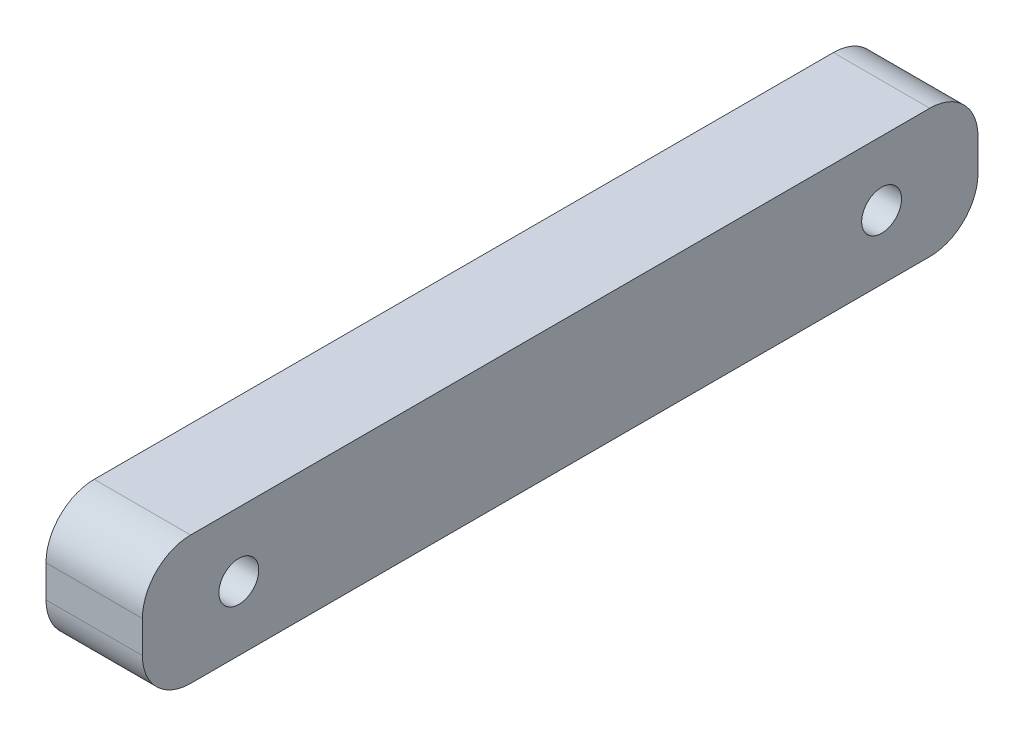
ISO-10303-21;
HEADER;
FILE_DESCRIPTION(('STEP AP214'),'2;1');
FILE_NAME('part.step','',(''),(''),'','','');
FILE_SCHEMA(('AUTOMOTIVE_DESIGN { 1 0 10303 214 1 1 1 1 }'));
ENDSEC;
DATA;
#1=APPLICATION_CONTEXT('core data for automotive mechanical design processes');
#2=APPLICATION_PROTOCOL_DEFINITION('international standard','automotive_design',2000,#1);
#3=PRODUCT_CONTEXT('',#1,'mechanical');
#4=PRODUCT('Part','Part','',(#3));
#5=PRODUCT_RELATED_PRODUCT_CATEGORY('part','',(#4));
#6=PRODUCT_DEFINITION_FORMATION('','',#4);
#7=PRODUCT_DEFINITION_CONTEXT('part definition',#1,'design');
#8=PRODUCT_DEFINITION('design','',#6,#7);
#9=PRODUCT_DEFINITION_SHAPE('','',#8);
#10=(LENGTH_UNIT() NAMED_UNIT(*) SI_UNIT(.MILLI.,.METRE.));
#11=(NAMED_UNIT(*) PLANE_ANGLE_UNIT() SI_UNIT($,.RADIAN.));
#12=(NAMED_UNIT(*) SI_UNIT($,.STERADIAN.) SOLID_ANGLE_UNIT());
#13=UNCERTAINTY_MEASURE_WITH_UNIT(LENGTH_MEASURE(1.E-05),#10,'distance_accuracy_value','');
#14=(GEOMETRIC_REPRESENTATION_CONTEXT(3) GLOBAL_UNCERTAINTY_ASSIGNED_CONTEXT((#13)) GLOBAL_UNIT_ASSIGNED_CONTEXT((#10,
#11,#12)) REPRESENTATION_CONTEXT('',''));
#15=CARTESIAN_POINT('',(0.,0.,0.));
#16=DIRECTION('',(0.,0.,1.));
#17=DIRECTION('',(1.,0.,0.));
#18=AXIS2_PLACEMENT_3D('',#15,#16,#17);
#19=CARTESIAN_POINT('',(19.05,-15.875,-155.575));
#20=DIRECTION('',(1.,0.,0.));
#21=DIRECTION('',(0.,0.,-1.));
#22=AXIS2_PLACEMENT_3D('',#19,#20,#21);
#23=PLANE('',#22);
#24=CARTESIAN_POINT('',(19.05,-12.7,-19.05));
#25=DIRECTION('',(1.,0.,0.));
#26=DIRECTION('',(0.,0.,-1.));
#27=AXIS2_PLACEMENT_3D('',#24,#25,#26);
#28=CIRCLE('',#27,3.937);
#29=CARTESIAN_POINT('',(19.05,-12.7,-15.113));
#30=VERTEX_POINT('',#29);
#31=EDGE_CURVE('E154',#30,#30,#28,.T.);
#32=ORIENTED_EDGE('',*,*,#31,.F.);
#33=EDGE_LOOP('',(#32));
#34=FACE_BOUND('',#33,.T.);
#35=CARTESIAN_POINT('',(19.05,-15.875,-155.575));
#36=DIRECTION('',(1.,0.,0.));
#37=DIRECTION('',(0.,0.,-1.));
#38=AXIS2_PLACEMENT_3D('',#35,#36,#37);
#39=CIRCLE('',#38,9.525);
#40=CARTESIAN_POINT('',(19.05,-25.4,-155.575));
#41=VERTEX_POINT('',#40);
#42=CARTESIAN_POINT('',(19.05,-15.8749999999999,-165.1));
#43=VERTEX_POINT('',#42);
#44=EDGE_CURVE('E172',#41,#43,#39,.T.);
#45=ORIENTED_EDGE('',*,*,#44,.T.);
#46=DIRECTION('',(0.,1.,0.));
#47=VECTOR('',#46,1.);
#48=CARTESIAN_POINT('',(19.05,-9.52500000000007,-165.1));
#49=LINE('',#48,#47);
#50=CARTESIAN_POINT('',(19.05,-9.52500000000006,-165.1));
#51=VERTEX_POINT('',#50);
#52=EDGE_CURVE('E107',#43,#51,#49,.T.);
#53=ORIENTED_EDGE('',*,*,#52,.T.);
#54=CARTESIAN_POINT('',(19.05,-9.525,-155.575));
#55=DIRECTION('',(1.,0.,0.));
#56=DIRECTION('',(0.,0.,1.));
#57=AXIS2_PLACEMENT_3D('',#54,#55,#56);
#58=CIRCLE('',#57,9.525);
#59=CARTESIAN_POINT('',(19.05,0.,-155.575));
#60=VERTEX_POINT('',#59);
#61=EDGE_CURVE('E194',#51,#60,#58,.T.);
#62=ORIENTED_EDGE('',*,*,#61,.T.);
#63=DIRECTION('',(0.,0.,1.));
#64=VECTOR('',#63,1.);
#65=CARTESIAN_POINT('',(19.05,0.,-9.525));
#66=LINE('',#65,#64);
#67=CARTESIAN_POINT('',(19.05,0.,-9.525));
#68=VERTEX_POINT('',#67);
#69=EDGE_CURVE('E208',#60,#68,#66,.T.);
#70=ORIENTED_EDGE('',*,*,#69,.T.);
#71=CARTESIAN_POINT('',(19.05,-9.525,-9.525));
#72=DIRECTION('',(1.,0.,0.));
#73=DIRECTION('',(0.,0.,-1.));
#74=AXIS2_PLACEMENT_3D('',#71,#72,#73);
#75=CIRCLE('',#74,9.525);
#76=CARTESIAN_POINT('',(19.05,-9.525,0.));
#77=VERTEX_POINT('',#76);
#78=EDGE_CURVE('E126',#68,#77,#75,.T.);
#79=ORIENTED_EDGE('',*,*,#78,.T.);
#80=DIRECTION('',(0.,-1.,0.));
#81=VECTOR('',#80,1.);
#82=CARTESIAN_POINT('',(19.05,-9.525,0.));
#83=LINE('',#82,#81);
#84=CARTESIAN_POINT('',(19.05,-15.875,0.));
#85=VERTEX_POINT('',#84);
#86=EDGE_CURVE('E120',#77,#85,#83,.T.);
#87=ORIENTED_EDGE('',*,*,#86,.T.);
#88=CARTESIAN_POINT('',(19.05,-15.875,-9.525));
#89=DIRECTION('',(1.,0.,0.));
#90=DIRECTION('',(0.,0.,-1.));
#91=AXIS2_PLACEMENT_3D('',#88,#89,#90);
#92=CIRCLE('',#91,9.525);
#93=CARTESIAN_POINT('',(19.05,-25.4,-9.525));
#94=VERTEX_POINT('',#93);
#95=EDGE_CURVE('E124',#85,#94,#92,.T.);
#96=ORIENTED_EDGE('',*,*,#95,.T.);
#97=DIRECTION('',(0.,0.,-1.));
#98=VECTOR('',#97,1.);
#99=CARTESIAN_POINT('',(19.05,-25.4,-9.525));
#100=LINE('',#99,#98);
#101=EDGE_CURVE('E64',#94,#41,#100,.T.);
#102=ORIENTED_EDGE('',*,*,#101,.T.);
#103=EDGE_LOOP('',(#45,#53,#62,#70,#79,#87,#96,#102));
#104=FACE_BOUND('',#103,.T.);
#105=CARTESIAN_POINT('',(19.05,-12.7,-146.05));
#106=DIRECTION('',(1.,0.,0.));
#107=DIRECTION('',(0.,0.,-1.));
#108=AXIS2_PLACEMENT_3D('',#105,#106,#107);
#109=CIRCLE('',#108,3.937);
#110=CARTESIAN_POINT('',(19.05,-12.7,-142.113));
#111=VERTEX_POINT('',#110);
#112=EDGE_CURVE('E223',#111,#111,#109,.T.);
#113=ORIENTED_EDGE('',*,*,#112,.F.);
#114=EDGE_LOOP('',(#113));
#115=FACE_BOUND('',#114,.T.);
#116=ADVANCED_FACE('F46',(#34,#104,#115),#23,.T.);
#117=CARTESIAN_POINT('',(0.,-15.875,-155.575));
#118=DIRECTION('',(1.,0.,0.));
#119=DIRECTION('',(0.,0.,-1.));
#120=AXIS2_PLACEMENT_3D('',#117,#118,#119);
#121=PLANE('',#120);
#122=CARTESIAN_POINT('',(0.,-15.875,-155.575));
#123=DIRECTION('',(1.,0.,0.));
#124=DIRECTION('',(0.,0.,-1.));
#125=AXIS2_PLACEMENT_3D('',#122,#123,#124);
#126=CIRCLE('',#125,9.525);
#127=CARTESIAN_POINT('',(0.,-25.4,-155.575));
#128=VERTEX_POINT('',#127);
#129=CARTESIAN_POINT('',(0.,-15.8749999999999,-165.1));
#130=VERTEX_POINT('',#129);
#131=EDGE_CURVE('E149',#128,#130,#126,.T.);
#132=ORIENTED_EDGE('',*,*,#131,.F.);
#133=DIRECTION('',(0.,0.,-1.));
#134=VECTOR('',#133,1.);
#135=CARTESIAN_POINT('',(0.,-25.4,-9.525));
#136=LINE('',#135,#134);
#137=CARTESIAN_POINT('',(0.,-25.4,-9.525));
#138=VERTEX_POINT('',#137);
#139=EDGE_CURVE('E99',#138,#128,#136,.T.);
#140=ORIENTED_EDGE('',*,*,#139,.F.);
#141=CARTESIAN_POINT('',(0.,-15.875,-9.525));
#142=DIRECTION('',(1.,0.,0.));
#143=DIRECTION('',(0.,0.,-1.));
#144=AXIS2_PLACEMENT_3D('',#141,#142,#143);
#145=CIRCLE('',#144,9.525);
#146=CARTESIAN_POINT('',(0.,-15.875,0.));
#147=VERTEX_POINT('',#146);
#148=EDGE_CURVE('E93',#147,#138,#145,.T.);
#149=ORIENTED_EDGE('',*,*,#148,.F.);
#150=DIRECTION('',(0.,-1.,0.));
#151=VECTOR('',#150,1.);
#152=CARTESIAN_POINT('',(0.,-9.525,0.));
#153=LINE('',#152,#151);
#154=CARTESIAN_POINT('',(0.,-9.525,0.));
#155=VERTEX_POINT('',#154);
#156=EDGE_CURVE('E135',#155,#147,#153,.T.);
#157=ORIENTED_EDGE('',*,*,#156,.F.);
#158=CARTESIAN_POINT('',(0.,-9.525,-9.525));
#159=DIRECTION('',(1.,0.,0.));
#160=DIRECTION('',(0.,0.,-1.));
#161=AXIS2_PLACEMENT_3D('',#158,#159,#160);
#162=CIRCLE('',#161,9.525);
#163=CARTESIAN_POINT('',(0.,0.,-9.525));
#164=VERTEX_POINT('',#163);
#165=EDGE_CURVE('E163',#164,#155,#162,.T.);
#166=ORIENTED_EDGE('',*,*,#165,.F.);
#167=DIRECTION('',(0.,0.,1.));
#168=VECTOR('',#167,1.);
#169=CARTESIAN_POINT('',(0.,0.,-9.525));
#170=LINE('',#169,#168);
#171=CARTESIAN_POINT('',(0.,0.,-155.575));
#172=VERTEX_POINT('',#171);
#173=EDGE_CURVE('E160',#172,#164,#170,.T.);
#174=ORIENTED_EDGE('',*,*,#173,.F.);
#175=CARTESIAN_POINT('',(0.,-9.525,-155.575));
#176=DIRECTION('',(1.,0.,0.));
#177=DIRECTION('',(0.,0.,1.));
#178=AXIS2_PLACEMENT_3D('',#175,#176,#177);
#179=CIRCLE('',#178,9.525);
#180=CARTESIAN_POINT('',(0.,-9.52500000000006,-165.1));
#181=VERTEX_POINT('',#180);
#182=EDGE_CURVE('E157',#181,#172,#179,.T.);
#183=ORIENTED_EDGE('',*,*,#182,.F.);
#184=DIRECTION('',(0.,1.,0.));
#185=VECTOR('',#184,1.);
#186=CARTESIAN_POINT('',(0.,-9.52500000000007,-165.1));
#187=LINE('',#186,#185);
#188=EDGE_CURVE('E153',#130,#181,#187,.T.);
#189=ORIENTED_EDGE('',*,*,#188,.F.);
#190=EDGE_LOOP('',(#132,#140,#149,#157,#166,#174,#183,#189));
#191=FACE_BOUND('',#190,.T.);
#192=CARTESIAN_POINT('',(0.,-12.7,-19.05));
#193=DIRECTION('',(1.,0.,0.));
#194=DIRECTION('',(0.,0.,-1.));
#195=AXIS2_PLACEMENT_3D('',#192,#193,#194);
#196=CIRCLE('',#195,3.937);
#197=CARTESIAN_POINT('',(0.,-12.7,-15.113));
#198=VERTEX_POINT('',#197);
#199=EDGE_CURVE('E219',#198,#198,#196,.T.);
#200=ORIENTED_EDGE('',*,*,#199,.T.);
#201=EDGE_LOOP('',(#200));
#202=FACE_BOUND('',#201,.T.);
#203=CARTESIAN_POINT('',(0.,-12.7,-146.05));
#204=DIRECTION('',(1.,0.,0.));
#205=DIRECTION('',(0.,0.,-1.));
#206=AXIS2_PLACEMENT_3D('',#203,#204,#205);
#207=CIRCLE('',#206,3.937);
#208=CARTESIAN_POINT('',(0.,-12.7,-142.113));
#209=VERTEX_POINT('',#208);
#210=EDGE_CURVE('E227',#209,#209,#207,.T.);
#211=ORIENTED_EDGE('',*,*,#210,.T.);
#212=EDGE_LOOP('',(#211));
#213=FACE_BOUND('',#212,.T.);
#214=ADVANCED_FACE('F198',(#191,#202,#213),#121,.F.);
#215=CARTESIAN_POINT('',(19.05,-15.875,-155.575));
#216=DIRECTION('',(-1.,0.,0.));
#217=DIRECTION('',(0.,0.,1.));
#218=AXIS2_PLACEMENT_3D('',#215,#216,#217);
#219=CYLINDRICAL_SURFACE('',#218,9.525);
#220=ORIENTED_EDGE('',*,*,#131,.T.);
#221=DIRECTION('',(-1.,0.,0.));
#222=VECTOR('',#221,1.);
#223=CARTESIAN_POINT('',(19.05,-15.8749999999999,-165.1));
#224=LINE('',#223,#222);
#225=EDGE_CURVE('E13',#43,#130,#224,.T.);
#226=ORIENTED_EDGE('',*,*,#225,.F.);
#227=ORIENTED_EDGE('',*,*,#44,.F.);
#228=DIRECTION('',(-1.,0.,0.));
#229=VECTOR('',#228,1.);
#230=CARTESIAN_POINT('',(19.05,-25.4,-155.575));
#231=LINE('',#230,#229);
#232=EDGE_CURVE('E145',#41,#128,#231,.T.);
#233=ORIENTED_EDGE('',*,*,#232,.T.);
#234=EDGE_LOOP('',(#220,#226,#227,#233));
#235=FACE_BOUND('',#234,.T.);
#236=ADVANCED_FACE('F48',(#235),#219,.T.);
#237=CARTESIAN_POINT('',(19.05,-9.52500000000007,-165.1));
#238=DIRECTION('',(0.,0.,1.));
#239=DIRECTION('',(1.,0.,0.));
#240=AXIS2_PLACEMENT_3D('',#237,#238,#239);
#241=PLANE('',#240);
#242=ORIENTED_EDGE('',*,*,#188,.T.);
#243=DIRECTION('',(-1.,0.,0.));
#244=VECTOR('',#243,1.);
#245=CARTESIAN_POINT('',(19.05,-9.52500000000006,-165.1));
#246=LINE('',#245,#244);
#247=EDGE_CURVE('E56',#51,#181,#246,.T.);
#248=ORIENTED_EDGE('',*,*,#247,.F.);
#249=ORIENTED_EDGE('',*,*,#52,.F.);
#250=ORIENTED_EDGE('',*,*,#225,.T.);
#251=EDGE_LOOP('',(#242,#248,#249,#250));
#252=FACE_BOUND('',#251,.T.);
#253=ADVANCED_FACE('F262',(#252),#241,.F.);
#254=CARTESIAN_POINT('',(19.05,-9.525,-155.575));
#255=DIRECTION('',(-1.,0.,0.));
#256=DIRECTION('',(0.,0.,1.));
#257=AXIS2_PLACEMENT_3D('',#254,#255,#256);
#258=CYLINDRICAL_SURFACE('',#257,9.525);
#259=ORIENTED_EDGE('',*,*,#182,.T.);
#260=DIRECTION('',(-1.,0.,0.));
#261=VECTOR('',#260,1.);
#262=CARTESIAN_POINT('',(19.05,0.,-155.575));
#263=LINE('',#262,#261);
#264=EDGE_CURVE('E183',#60,#172,#263,.T.);
#265=ORIENTED_EDGE('',*,*,#264,.F.);
#266=ORIENTED_EDGE('',*,*,#61,.F.);
#267=ORIENTED_EDGE('',*,*,#247,.T.);
#268=EDGE_LOOP('',(#259,#265,#266,#267));
#269=FACE_BOUND('',#268,.T.);
#270=ADVANCED_FACE('F192',(#269),#258,.T.);
#271=CARTESIAN_POINT('',(19.05,0.,-9.525));
#272=DIRECTION('',(0.,-1.,0.));
#273=DIRECTION('',(0.,0.,-1.));
#274=AXIS2_PLACEMENT_3D('',#271,#272,#273);
#275=PLANE('',#274);
#276=ORIENTED_EDGE('',*,*,#173,.T.);
#277=DIRECTION('',(-1.,0.,0.));
#278=VECTOR('',#277,1.);
#279=CARTESIAN_POINT('',(19.05,0.,-9.525));
#280=LINE('',#279,#278);
#281=EDGE_CURVE('E179',#68,#164,#280,.T.);
#282=ORIENTED_EDGE('',*,*,#281,.F.);
#283=ORIENTED_EDGE('',*,*,#69,.F.);
#284=ORIENTED_EDGE('',*,*,#264,.T.);
#285=EDGE_LOOP('',(#276,#282,#283,#284));
#286=FACE_BOUND('',#285,.T.);
#287=ADVANCED_FACE('F203',(#286),#275,.F.);
#288=CARTESIAN_POINT('',(19.05,-9.525,-9.525));
#289=DIRECTION('',(-1.,0.,0.));
#290=DIRECTION('',(0.,0.,1.));
#291=AXIS2_PLACEMENT_3D('',#288,#289,#290);
#292=CYLINDRICAL_SURFACE('',#291,9.525);
#293=ORIENTED_EDGE('',*,*,#165,.T.);
#294=DIRECTION('',(-1.,0.,0.));
#295=VECTOR('',#294,1.);
#296=CARTESIAN_POINT('',(19.05,-9.525,0.));
#297=LINE('',#296,#295);
#298=EDGE_CURVE('E137',#77,#155,#297,.T.);
#299=ORIENTED_EDGE('',*,*,#298,.F.);
#300=ORIENTED_EDGE('',*,*,#78,.F.);
#301=ORIENTED_EDGE('',*,*,#281,.T.);
#302=EDGE_LOOP('',(#293,#299,#300,#301));
#303=FACE_BOUND('',#302,.T.);
#304=ADVANCED_FACE('F206',(#303),#292,.T.);
#305=CARTESIAN_POINT('',(19.05,-9.525,0.));
#306=DIRECTION('',(0.,0.,-1.));
#307=DIRECTION('',(0.,1.,0.));
#308=AXIS2_PLACEMENT_3D('',#305,#306,#307);
#309=PLANE('',#308);
#310=ORIENTED_EDGE('',*,*,#156,.T.);
#311=DIRECTION('',(-1.,0.,0.));
#312=VECTOR('',#311,1.);
#313=CARTESIAN_POINT('',(19.05,-15.875,0.));
#314=LINE('',#313,#312);
#315=EDGE_CURVE('E132',#85,#147,#314,.T.);
#316=ORIENTED_EDGE('',*,*,#315,.F.);
#317=ORIENTED_EDGE('',*,*,#86,.F.);
#318=ORIENTED_EDGE('',*,*,#298,.T.);
#319=EDGE_LOOP('',(#310,#316,#317,#318));
#320=FACE_BOUND('',#319,.T.);
#321=ADVANCED_FACE('F133',(#320),#309,.F.);
#322=CARTESIAN_POINT('',(19.05,-15.875,-9.525));
#323=DIRECTION('',(-1.,0.,0.));
#324=DIRECTION('',(0.,0.,1.));
#325=AXIS2_PLACEMENT_3D('',#322,#323,#324);
#326=CYLINDRICAL_SURFACE('',#325,9.525);
#327=ORIENTED_EDGE('',*,*,#148,.T.);
#328=DIRECTION('',(-1.,0.,0.));
#329=VECTOR('',#328,1.);
#330=CARTESIAN_POINT('',(19.05,-25.4,-9.525));
#331=LINE('',#330,#329);
#332=EDGE_CURVE('E138',#94,#138,#331,.T.);
#333=ORIENTED_EDGE('',*,*,#332,.F.);
#334=ORIENTED_EDGE('',*,*,#95,.F.);
#335=ORIENTED_EDGE('',*,*,#315,.T.);
#336=EDGE_LOOP('',(#327,#333,#334,#335));
#337=FACE_BOUND('',#336,.T.);
#338=ADVANCED_FACE('F140',(#337),#326,.T.);
#339=CARTESIAN_POINT('',(19.05,-25.4,-9.525));
#340=DIRECTION('',(0.,1.,0.));
#341=DIRECTION('',(0.,0.,1.));
#342=AXIS2_PLACEMENT_3D('',#339,#340,#341);
#343=PLANE('',#342);
#344=ORIENTED_EDGE('',*,*,#139,.T.);
#345=ORIENTED_EDGE('',*,*,#232,.F.);
#346=ORIENTED_EDGE('',*,*,#101,.F.);
#347=ORIENTED_EDGE('',*,*,#332,.T.);
#348=EDGE_LOOP('',(#344,#345,#346,#347));
#349=FACE_BOUND('',#348,.T.);
#350=ADVANCED_FACE('F250',(#349),#343,.F.);
#351=CARTESIAN_POINT('',(19.05,-12.7,-19.05));
#352=DIRECTION('',(-1.,0.,0.));
#353=DIRECTION('',(0.,0.,1.));
#354=AXIS2_PLACEMENT_3D('',#351,#352,#353);
#355=CYLINDRICAL_SURFACE('',#354,3.937);
#356=CARTESIAN_POINT('',(19.05,-12.7,-15.113));
#357=CARTESIAN_POINT('',(18.8515625,-12.7,-15.113));
#358=CARTESIAN_POINT('',(18.653125,-12.7,-15.113));
#359=CARTESIAN_POINT('',(18.25625,-12.7,-15.113));
#360=CARTESIAN_POINT('',(18.0578125,-12.7,-15.113));
#361=CARTESIAN_POINT('',(17.6609375,-12.7,-15.113));
#362=CARTESIAN_POINT('',(17.4625,-12.7,-15.113));
#363=CARTESIAN_POINT('',(17.065625,-12.7,-15.113));
#364=CARTESIAN_POINT('',(16.8671875,-12.7,-15.113));
#365=CARTESIAN_POINT('',(16.4703125,-12.7,-15.113));
#366=CARTESIAN_POINT('',(16.271875,-12.7,-15.113));
#367=CARTESIAN_POINT('',(15.875,-12.7,-15.113));
#368=CARTESIAN_POINT('',(15.6765625,-12.7,-15.113));
#369=CARTESIAN_POINT('',(15.2796875,-12.7,-15.113));
#370=CARTESIAN_POINT('',(15.08125,-12.7,-15.113));
#371=CARTESIAN_POINT('',(14.684375,-12.7,-15.113));
#372=CARTESIAN_POINT('',(14.4859375,-12.7,-15.113));
#373=CARTESIAN_POINT('',(14.0890625,-12.7,-15.113));
#374=CARTESIAN_POINT('',(13.890625,-12.7,-15.113));
#375=CARTESIAN_POINT('',(13.49375,-12.7,-15.113));
#376=CARTESIAN_POINT('',(13.2953125,-12.7,-15.113));
#377=CARTESIAN_POINT('',(12.8984375,-12.7,-15.113));
#378=CARTESIAN_POINT('',(12.7,-12.7,-15.113));
#379=CARTESIAN_POINT('',(12.303125,-12.7,-15.113));
#380=CARTESIAN_POINT('',(12.1046875,-12.7,-15.113));
#381=CARTESIAN_POINT('',(11.7078125,-12.7,-15.113));
#382=CARTESIAN_POINT('',(11.509375,-12.7,-15.113));
#383=CARTESIAN_POINT('',(11.1125,-12.7,-15.113));
#384=CARTESIAN_POINT('',(10.9140625,-12.7,-15.113));
#385=CARTESIAN_POINT('',(10.5171875,-12.7,-15.113));
#386=CARTESIAN_POINT('',(10.31875,-12.7,-15.113));
#387=CARTESIAN_POINT('',(9.921875,-12.7,-15.113));
#388=CARTESIAN_POINT('',(9.7234375,-12.7,-15.113));
#389=CARTESIAN_POINT('',(9.3265625,-12.7,-15.113));
#390=CARTESIAN_POINT('',(9.128125,-12.7,-15.113));
#391=CARTESIAN_POINT('',(8.73125,-12.7,-15.113));
#392=CARTESIAN_POINT('',(8.5328125,-12.7,-15.113));
#393=CARTESIAN_POINT('',(8.1359375,-12.7,-15.113));
#394=CARTESIAN_POINT('',(7.9375,-12.7,-15.113));
#395=CARTESIAN_POINT('',(7.540625,-12.7,-15.113));
#396=CARTESIAN_POINT('',(7.3421875,-12.7,-15.113));
#397=CARTESIAN_POINT('',(6.9453125,-12.7,-15.113));
#398=CARTESIAN_POINT('',(6.746875,-12.7,-15.113));
#399=CARTESIAN_POINT('',(6.35,-12.7,-15.113));
#400=CARTESIAN_POINT('',(6.1515625,-12.7,-15.113));
#401=CARTESIAN_POINT('',(5.7546875,-12.7,-15.113));
#402=CARTESIAN_POINT('',(5.55625,-12.7,-15.113));
#403=CARTESIAN_POINT('',(5.159375,-12.7,-15.113));
#404=CARTESIAN_POINT('',(4.9609375,-12.7,-15.113));
#405=CARTESIAN_POINT('',(4.5640625,-12.7,-15.113));
#406=CARTESIAN_POINT('',(4.365625,-12.7,-15.113));
#407=CARTESIAN_POINT('',(3.96875,-12.7,-15.113));
#408=CARTESIAN_POINT('',(3.7703125,-12.7,-15.113));
#409=CARTESIAN_POINT('',(3.3734375,-12.7,-15.113));
#410=CARTESIAN_POINT('',(3.175,-12.7,-15.113));
#411=CARTESIAN_POINT('',(2.778125,-12.7,-15.113));
#412=CARTESIAN_POINT('',(2.5796875,-12.7,-15.113));
#413=CARTESIAN_POINT('',(2.1828125,-12.7,-15.113));
#414=CARTESIAN_POINT('',(1.984375,-12.7,-15.113));
#415=CARTESIAN_POINT('',(1.5875,-12.7,-15.113));
#416=CARTESIAN_POINT('',(1.3890625,-12.7,-15.113));
#417=CARTESIAN_POINT('',(0.992187500000001,-12.7,-15.113));
#418=CARTESIAN_POINT('',(0.793750000000001,-12.7,-15.113));
#419=CARTESIAN_POINT('',(0.396875,-12.7,-15.113));
#420=CARTESIAN_POINT('',(0.1984375,-12.7,-15.113));
#421=CARTESIAN_POINT('',(0.,-12.7,-15.113));
#422=B_SPLINE_CURVE_WITH_KNOTS('',3,(#356,#357,#358,#359,#360,#361,#362,#363,#364,#365,#366,
#367,#368,#369,#370,#371,#372,#373,#374,#375,#376,#377,#378,#379,#380,#381,#382,#383,#384,#385,
#386,#387,#388,#389,#390,#391,#392,#393,#394,#395,#396,#397,#398,#399,#400,#401,#402,#403,#404,
#405,#406,#407,#408,#409,#410,#411,#412,#413,#414,#415,#416,#417,#418,#419,#420,#421),
.UNSPECIFIED.,.F.,.F.,(4,2,2,2,2,2,2,2,2,2,2,2,2,2,2,2,2,2,2,2,2,2,2,2,2,2,2,2,2,2,2,2,4),(0.,
0.595312499999997,1.190625,1.7859375,2.38125,2.9765625,3.571875,4.1671875,4.7625,5.3578125,
5.953125,6.5484375,7.14375,7.7390625,8.334375,8.9296875,9.525,10.1203125,10.715625,11.3109375,
11.90625,12.5015625,13.096875,13.6921875,14.2875,14.8828125,15.478125,16.0734375,16.66875,
17.2640625,17.859375,18.4546875,19.05),.UNSPECIFIED.);
#423=EDGE_CURVE('BSEAM247',#30,#198,#422,.T.);
#424=ORIENTED_EDGE('',*,*,#31,.T.);
#425=ORIENTED_EDGE('',*,*,#199,.F.);
#426=ORIENTED_EDGE('',*,*,#423,.T.);
#427=ORIENTED_EDGE('',*,*,#423,.F.);
#428=EDGE_LOOP('',(#424,#426,#425,#427));
#429=FACE_BOUND('',#428,.T.);
#430=ADVANCED_FACE('F247',(#429),#355,.F.);
#431=CARTESIAN_POINT('',(19.05,-12.7,-146.05));
#432=DIRECTION('',(-1.,0.,0.));
#433=DIRECTION('',(0.,0.,1.));
#434=AXIS2_PLACEMENT_3D('',#431,#432,#433);
#435=CYLINDRICAL_SURFACE('',#434,3.937);
#436=CARTESIAN_POINT('',(19.05,-12.7,-142.113));
#437=CARTESIAN_POINT('',(18.8515625,-12.7,-142.113));
#438=CARTESIAN_POINT('',(18.653125,-12.7,-142.113));
#439=CARTESIAN_POINT('',(18.25625,-12.7,-142.113));
#440=CARTESIAN_POINT('',(18.0578125,-12.7,-142.113));
#441=CARTESIAN_POINT('',(17.6609375,-12.7,-142.113));
#442=CARTESIAN_POINT('',(17.4625,-12.7,-142.113));
#443=CARTESIAN_POINT('',(17.065625,-12.7,-142.113));
#444=CARTESIAN_POINT('',(16.8671875,-12.7,-142.113));
#445=CARTESIAN_POINT('',(16.4703125,-12.7,-142.113));
#446=CARTESIAN_POINT('',(16.271875,-12.7,-142.113));
#447=CARTESIAN_POINT('',(15.875,-12.7,-142.113));
#448=CARTESIAN_POINT('',(15.6765625,-12.7,-142.113));
#449=CARTESIAN_POINT('',(15.2796875,-12.7,-142.113));
#450=CARTESIAN_POINT('',(15.08125,-12.7,-142.113));
#451=CARTESIAN_POINT('',(14.684375,-12.7,-142.113));
#452=CARTESIAN_POINT('',(14.4859375,-12.7,-142.113));
#453=CARTESIAN_POINT('',(14.0890625,-12.7,-142.113));
#454=CARTESIAN_POINT('',(13.890625,-12.7,-142.113));
#455=CARTESIAN_POINT('',(13.49375,-12.7,-142.113));
#456=CARTESIAN_POINT('',(13.2953125,-12.7,-142.113));
#457=CARTESIAN_POINT('',(12.8984375,-12.7,-142.113));
#458=CARTESIAN_POINT('',(12.7,-12.7,-142.113));
#459=CARTESIAN_POINT('',(12.303125,-12.7,-142.113));
#460=CARTESIAN_POINT('',(12.1046875,-12.7,-142.113));
#461=CARTESIAN_POINT('',(11.7078125,-12.7,-142.113));
#462=CARTESIAN_POINT('',(11.509375,-12.7,-142.113));
#463=CARTESIAN_POINT('',(11.1125,-12.7,-142.113));
#464=CARTESIAN_POINT('',(10.9140625,-12.7,-142.113));
#465=CARTESIAN_POINT('',(10.5171875,-12.7,-142.113));
#466=CARTESIAN_POINT('',(10.31875,-12.7,-142.113));
#467=CARTESIAN_POINT('',(9.921875,-12.7,-142.113));
#468=CARTESIAN_POINT('',(9.7234375,-12.7,-142.113));
#469=CARTESIAN_POINT('',(9.3265625,-12.7,-142.113));
#470=CARTESIAN_POINT('',(9.128125,-12.7,-142.113));
#471=CARTESIAN_POINT('',(8.73125,-12.7,-142.113));
#472=CARTESIAN_POINT('',(8.5328125,-12.7,-142.113));
#473=CARTESIAN_POINT('',(8.1359375,-12.7,-142.113));
#474=CARTESIAN_POINT('',(7.9375,-12.7,-142.113));
#475=CARTESIAN_POINT('',(7.540625,-12.7,-142.113));
#476=CARTESIAN_POINT('',(7.3421875,-12.7,-142.113));
#477=CARTESIAN_POINT('',(6.9453125,-12.7,-142.113));
#478=CARTESIAN_POINT('',(6.746875,-12.7,-142.113));
#479=CARTESIAN_POINT('',(6.35,-12.7,-142.113));
#480=CARTESIAN_POINT('',(6.1515625,-12.7,-142.113));
#481=CARTESIAN_POINT('',(5.7546875,-12.7,-142.113));
#482=CARTESIAN_POINT('',(5.55625,-12.7,-142.113));
#483=CARTESIAN_POINT('',(5.159375,-12.7,-142.113));
#484=CARTESIAN_POINT('',(4.9609375,-12.7,-142.113));
#485=CARTESIAN_POINT('',(4.5640625,-12.7,-142.113));
#486=CARTESIAN_POINT('',(4.365625,-12.7,-142.113));
#487=CARTESIAN_POINT('',(3.96875,-12.7,-142.113));
#488=CARTESIAN_POINT('',(3.7703125,-12.7,-142.113));
#489=CARTESIAN_POINT('',(3.3734375,-12.7,-142.113));
#490=CARTESIAN_POINT('',(3.175,-12.7,-142.113));
#491=CARTESIAN_POINT('',(2.778125,-12.7,-142.113));
#492=CARTESIAN_POINT('',(2.5796875,-12.7,-142.113));
#493=CARTESIAN_POINT('',(2.1828125,-12.7,-142.113));
#494=CARTESIAN_POINT('',(1.984375,-12.7,-142.113));
#495=CARTESIAN_POINT('',(1.5875,-12.7,-142.113));
#496=CARTESIAN_POINT('',(1.3890625,-12.7,-142.113));
#497=CARTESIAN_POINT('',(0.992187500000001,-12.7,-142.113));
#498=CARTESIAN_POINT('',(0.793750000000001,-12.7,-142.113));
#499=CARTESIAN_POINT('',(0.396875,-12.7,-142.113));
#500=CARTESIAN_POINT('',(0.1984375,-12.7,-142.113));
#501=CARTESIAN_POINT('',(0.,-12.7,-142.113));
#502=B_SPLINE_CURVE_WITH_KNOTS('',3,(#436,#437,#438,#439,#440,#441,#442,#443,#444,#445,#446,
#447,#448,#449,#450,#451,#452,#453,#454,#455,#456,#457,#458,#459,#460,#461,#462,#463,#464,#465,
#466,#467,#468,#469,#470,#471,#472,#473,#474,#475,#476,#477,#478,#479,#480,#481,#482,#483,#484,
#485,#486,#487,#488,#489,#490,#491,#492,#493,#494,#495,#496,#497,#498,#499,#500,#501),
.UNSPECIFIED.,.F.,.F.,(4,2,2,2,2,2,2,2,2,2,2,2,2,2,2,2,2,2,2,2,2,2,2,2,2,2,2,2,2,2,2,2,4),(0.,
0.595312499999997,1.190625,1.7859375,2.38125,2.9765625,3.571875,4.1671875,4.7625,5.3578125,
5.953125,6.5484375,7.14375,7.7390625,8.334375,8.9296875,9.525,10.1203125,10.715625,11.3109375,
11.90625,12.5015625,13.096875,13.6921875,14.2875,14.8828125,15.478125,16.0734375,16.66875,
17.2640625,17.859375,18.4546875,19.05),.UNSPECIFIED.);
#503=EDGE_CURVE('BSEAM236',#111,#209,#502,.T.);
#504=ORIENTED_EDGE('',*,*,#112,.T.);
#505=ORIENTED_EDGE('',*,*,#210,.F.);
#506=ORIENTED_EDGE('',*,*,#503,.T.);
#507=ORIENTED_EDGE('',*,*,#503,.F.);
#508=EDGE_LOOP('',(#504,#506,#505,#507));
#509=FACE_BOUND('',#508,.T.);
#510=ADVANCED_FACE('F236',(#509),#435,.F.);
#511=CLOSED_SHELL('',(#116,#214,#236,#253,#270,#287,#304,#321,#338,#350,#430,#510));
#512=MANIFOLD_SOLID_BREP('B2',#511);
#513=ADVANCED_BREP_SHAPE_REPRESENTATION('',(#18,#512),#14);
#514=SHAPE_DEFINITION_REPRESENTATION(#9,#513);
ENDSEC;
END-ISO-10303-21;
